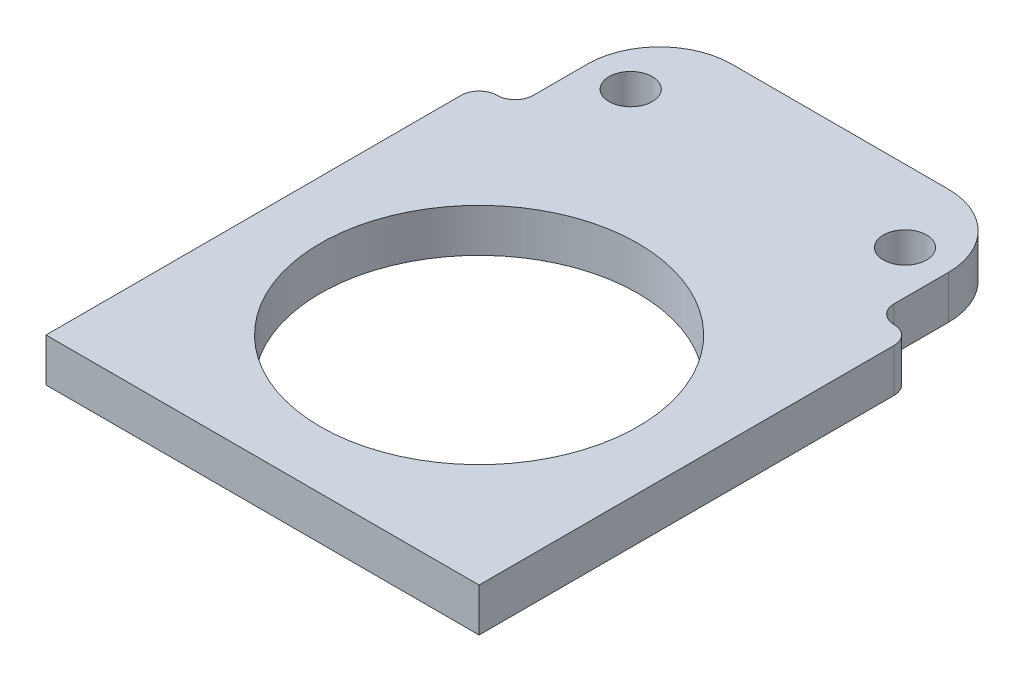
ISO-10303-21;
HEADER;
FILE_DESCRIPTION(('STEP AP214'),'2;1');
FILE_NAME('part.step','',(''),(''),'','','');
FILE_SCHEMA(('AUTOMOTIVE_DESIGN { 1 0 10303 214 1 1 1 1 }'));
ENDSEC;
DATA;
#1=APPLICATION_CONTEXT('core data for automotive mechanical design processes');
#2=APPLICATION_PROTOCOL_DEFINITION('international standard','automotive_design',2000,#1);
#3=PRODUCT_CONTEXT('',#1,'mechanical');
#4=PRODUCT('Part','Part','',(#3));
#5=PRODUCT_RELATED_PRODUCT_CATEGORY('part','',(#4));
#6=PRODUCT_DEFINITION_FORMATION('','',#4);
#7=PRODUCT_DEFINITION_CONTEXT('part definition',#1,'design');
#8=PRODUCT_DEFINITION('design','',#6,#7);
#9=PRODUCT_DEFINITION_SHAPE('','',#8);
#10=(LENGTH_UNIT() NAMED_UNIT(*) SI_UNIT(.MILLI.,.METRE.));
#11=(NAMED_UNIT(*) PLANE_ANGLE_UNIT() SI_UNIT($,.RADIAN.));
#12=(NAMED_UNIT(*) SI_UNIT($,.STERADIAN.) SOLID_ANGLE_UNIT());
#13=UNCERTAINTY_MEASURE_WITH_UNIT(LENGTH_MEASURE(1.E-05),#10,'distance_accuracy_value','');
#14=(GEOMETRIC_REPRESENTATION_CONTEXT(3) GLOBAL_UNCERTAINTY_ASSIGNED_CONTEXT((#13)) GLOBAL_UNIT_ASSIGNED_CONTEXT((#10,
#11,#12)) REPRESENTATION_CONTEXT('',''));
#15=CARTESIAN_POINT('',(0.,0.,0.));
#16=DIRECTION('',(0.,0.,1.));
#17=DIRECTION('',(1.,0.,0.));
#18=AXIS2_PLACEMENT_3D('',#15,#16,#17);
#19=CARTESIAN_POINT('',(12.5,3.,0.));
#20=DIRECTION('',(-1.,0.,0.));
#21=DIRECTION('',(0.,0.,1.));
#22=AXIS2_PLACEMENT_3D('',#19,#20,#21);
#23=PLANE('',#22);
#24=DIRECTION('',(0.,0.,-1.));
#25=VECTOR('',#24,1.);
#26=CARTESIAN_POINT('',(12.5,0.,0.));
#27=LINE('',#26,#25);
#28=CARTESIAN_POINT('',(12.5,0.,3.75));
#29=VERTEX_POINT('',#28);
#30=CARTESIAN_POINT('',(12.5,0.,0.));
#31=VERTEX_POINT('',#30);
#32=EDGE_CURVE('E214',#29,#31,#27,.T.);
#33=ORIENTED_EDGE('',*,*,#32,.T.);
#34=DIRECTION('',(0.,-1.,0.));
#35=VECTOR('',#34,1.);
#36=CARTESIAN_POINT('',(12.5,3.,0.));
#37=LINE('',#36,#35);
#38=CARTESIAN_POINT('',(12.5,3.,0.));
#39=VERTEX_POINT('',#38);
#40=EDGE_CURVE('E71',#31,#39,#37,.F.);
#41=ORIENTED_EDGE('',*,*,#40,.T.);
#42=DIRECTION('',(0.,0.,-1.));
#43=VECTOR('',#42,1.);
#44=CARTESIAN_POINT('',(12.5,3.,0.));
#45=LINE('',#44,#43);
#46=CARTESIAN_POINT('',(12.5,3.,3.75));
#47=VERTEX_POINT('',#46);
#48=EDGE_CURVE('E195',#47,#39,#45,.T.);
#49=ORIENTED_EDGE('',*,*,#48,.F.);
#50=DIRECTION('',(0.,-1.,0.));
#51=VECTOR('',#50,1.);
#52=CARTESIAN_POINT('',(12.5,0.,3.75));
#53=LINE('',#52,#51);
#54=EDGE_CURVE('E244',#47,#29,#53,.T.);
#55=ORIENTED_EDGE('',*,*,#54,.T.);
#56=EDGE_LOOP('',(#33,#41,#49,#55));
#57=FACE_BOUND('',#56,.T.);
#58=ADVANCED_FACE('F47',(#57),#23,.F.);
#59=CARTESIAN_POINT('',(0.,3.,-5.));
#60=DIRECTION('',(0.,0.,-1.));
#61=DIRECTION('',(-1.,0.,0.));
#62=AXIS2_PLACEMENT_3D('',#59,#60,#61);
#63=PLANE('',#62);
#64=DIRECTION('',(1.,0.,0.));
#65=VECTOR('',#64,1.);
#66=CARTESIAN_POINT('',(0.,3.,-5.));
#67=LINE('',#66,#65);
#68=CARTESIAN_POINT('',(-7.50000000000001,3.,-5.));
#69=VERTEX_POINT('',#68);
#70=CARTESIAN_POINT('',(7.5,3.,-5.));
#71=VERTEX_POINT('',#70);
#72=EDGE_CURVE('E199',#69,#71,#67,.T.);
#73=ORIENTED_EDGE('',*,*,#72,.T.);
#74=DIRECTION('',(0.,-1.,0.));
#75=VECTOR('',#74,1.);
#76=CARTESIAN_POINT('',(7.5,0.,-5.));
#77=LINE('',#76,#75);
#78=CARTESIAN_POINT('',(7.5,0.,-5.));
#79=VERTEX_POINT('',#78);
#80=EDGE_CURVE('E272',#71,#79,#77,.T.);
#81=ORIENTED_EDGE('',*,*,#80,.T.);
#82=DIRECTION('',(1.,0.,0.));
#83=VECTOR('',#82,1.);
#84=CARTESIAN_POINT('',(0.,0.,-5.));
#85=LINE('',#84,#83);
#86=CARTESIAN_POINT('',(-7.50000000000001,0.,-5.));
#87=VERTEX_POINT('',#86);
#88=EDGE_CURVE('E217',#87,#79,#85,.T.);
#89=ORIENTED_EDGE('',*,*,#88,.F.);
#90=DIRECTION('',(0.,-1.,0.));
#91=VECTOR('',#90,1.);
#92=CARTESIAN_POINT('',(-7.50000000000001,3.,-5.));
#93=LINE('',#92,#91);
#94=EDGE_CURVE('E262',#87,#69,#93,.F.);
#95=ORIENTED_EDGE('',*,*,#94,.T.);
#96=EDGE_LOOP('',(#73,#81,#89,#95));
#97=FACE_BOUND('',#96,.T.);
#98=ADVANCED_FACE('F292',(#97),#63,.T.);
#99=CARTESIAN_POINT('',(-12.5,3.,0.));
#100=DIRECTION('',(-1.,0.,0.));
#101=DIRECTION('',(0.,0.,1.));
#102=AXIS2_PLACEMENT_3D('',#99,#100,#101);
#103=PLANE('',#102);
#104=DIRECTION('',(0.,0.,-1.));
#105=VECTOR('',#104,1.);
#106=CARTESIAN_POINT('',(-12.5,3.,0.));
#107=LINE('',#106,#105);
#108=CARTESIAN_POINT('',(-12.5,3.,3.75));
#109=VERTEX_POINT('',#108);
#110=CARTESIAN_POINT('',(-12.5,3.,0.));
#111=VERTEX_POINT('',#110);
#112=EDGE_CURVE('E203',#109,#111,#107,.T.);
#113=ORIENTED_EDGE('',*,*,#112,.T.);
#114=DIRECTION('',(0.,-1.,0.));
#115=VECTOR('',#114,1.);
#116=CARTESIAN_POINT('',(-12.5,3.,0.));
#117=LINE('',#116,#115);
#118=CARTESIAN_POINT('',(-12.5,0.,0.));
#119=VERTEX_POINT('',#118);
#120=EDGE_CURVE('E11',#111,#119,#117,.T.);
#121=ORIENTED_EDGE('',*,*,#120,.T.);
#122=DIRECTION('',(0.,0.,-1.));
#123=VECTOR('',#122,1.);
#124=CARTESIAN_POINT('',(-12.5,0.,0.));
#125=LINE('',#124,#123);
#126=CARTESIAN_POINT('',(-12.5,0.,3.75));
#127=VERTEX_POINT('',#126);
#128=EDGE_CURVE('E220',#127,#119,#125,.T.);
#129=ORIENTED_EDGE('',*,*,#128,.F.);
#130=DIRECTION('',(0.,-1.,0.));
#131=VECTOR('',#130,1.);
#132=CARTESIAN_POINT('',(-12.5,3.,3.75));
#133=LINE('',#132,#131);
#134=EDGE_CURVE('E247',#127,#109,#133,.F.);
#135=ORIENTED_EDGE('',*,*,#134,.T.);
#136=EDGE_LOOP('',(#113,#121,#129,#135));
#137=FACE_BOUND('',#136,.T.);
#138=ADVANCED_FACE('F322',(#137),#103,.T.);
#139=CARTESIAN_POINT('',(-9.5,3.,0.));
#140=DIRECTION('',(0.,-1.,0.));
#141=DIRECTION('',(0.,0.,-1.));
#142=AXIS2_PLACEMENT_3D('',#139,#140,#141);
#143=CYLINDRICAL_SURFACE('',#142,1.5);
#144=CARTESIAN_POINT('',(-9.5,3.,0.));
#145=DIRECTION('',(0.,1.,0.));
#146=DIRECTION('',(0.,0.,1.));
#147=AXIS2_PLACEMENT_3D('',#144,#145,#146);
#148=CIRCLE('',#147,1.5);
#149=CARTESIAN_POINT('',(-9.5,3.,1.5));
#150=VERTEX_POINT('',#149);
#151=EDGE_CURVE('E191',#150,#150,#148,.T.);
#152=ORIENTED_EDGE('',*,*,#151,.T.);
#153=EDGE_LOOP('',(#152));
#154=FACE_BOUND('',#153,.T.);
#155=CARTESIAN_POINT('',(-9.5,0.,0.));
#156=DIRECTION('',(0.,1.,0.));
#157=DIRECTION('',(0.,0.,1.));
#158=AXIS2_PLACEMENT_3D('',#155,#156,#157);
#159=CIRCLE('',#158,1.5);
#160=CARTESIAN_POINT('',(-9.5,0.,1.5));
#161=VERTEX_POINT('',#160);
#162=EDGE_CURVE('E189',#161,#161,#159,.T.);
#163=ORIENTED_EDGE('',*,*,#162,.F.);
#164=EDGE_LOOP('',(#163));
#165=FACE_BOUND('',#164,.T.);
#166=ADVANCED_FACE('F338',(#154,#165),#143,.F.);
#167=CARTESIAN_POINT('',(9.49999999999997,3.,0.));
#168=DIRECTION('',(0.,-1.,0.));
#169=DIRECTION('',(0.,0.,-1.));
#170=AXIS2_PLACEMENT_3D('',#167,#168,#169);
#171=CYLINDRICAL_SURFACE('',#170,1.5);
#172=CARTESIAN_POINT('',(9.49999999999997,3.,0.));
#173=DIRECTION('',(0.,1.,0.));
#174=DIRECTION('',(0.,0.,1.));
#175=AXIS2_PLACEMENT_3D('',#172,#173,#174);
#176=CIRCLE('',#175,1.5);
#177=CARTESIAN_POINT('',(9.49999999999997,3.,1.5));
#178=VERTEX_POINT('',#177);
#179=EDGE_CURVE('E206',#178,#178,#176,.F.);
#180=ORIENTED_EDGE('',*,*,#179,.F.);
#181=EDGE_LOOP('',(#180));
#182=FACE_BOUND('',#181,.T.);
#183=CARTESIAN_POINT('',(9.49999999999997,0.,0.));
#184=DIRECTION('',(0.,1.,0.));
#185=DIRECTION('',(0.,0.,1.));
#186=AXIS2_PLACEMENT_3D('',#183,#184,#185);
#187=CIRCLE('',#186,1.5);
#188=CARTESIAN_POINT('',(9.49999999999997,0.,1.5));
#189=VERTEX_POINT('',#188);
#190=EDGE_CURVE('E196',#189,#189,#187,.F.);
#191=ORIENTED_EDGE('',*,*,#190,.T.);
#192=EDGE_LOOP('',(#191));
#193=FACE_BOUND('',#192,.T.);
#194=ADVANCED_FACE('F341',(#182,#193),#171,.F.);
#195=CARTESIAN_POINT('',(0.,3.,0.));
#196=DIRECTION('',(0.,1.,0.));
#197=DIRECTION('',(0.,0.,1.));
#198=AXIS2_PLACEMENT_3D('',#195,#196,#197);
#199=PLANE('',#198);
#200=ORIENTED_EDGE('',*,*,#151,.F.);
#201=EDGE_LOOP('',(#200));
#202=FACE_BOUND('',#201,.T.);
#203=ORIENTED_EDGE('',*,*,#48,.T.);
#204=CARTESIAN_POINT('',(7.5,3.,0.));
#205=DIRECTION('',(0.,1.,0.));
#206=DIRECTION('',(0.,0.,1.));
#207=AXIS2_PLACEMENT_3D('',#204,#205,#206);
#208=CIRCLE('',#207,5.);
#209=EDGE_CURVE('E56',#39,#71,#208,.T.);
#210=ORIENTED_EDGE('',*,*,#209,.T.);
#211=ORIENTED_EDGE('',*,*,#72,.F.);
#212=CARTESIAN_POINT('',(-7.50000000000001,3.,0.));
#213=DIRECTION('',(0.,1.,0.));
#214=DIRECTION('',(0.,0.,1.));
#215=AXIS2_PLACEMENT_3D('',#212,#213,#214);
#216=CIRCLE('',#215,5.);
#217=EDGE_CURVE('E63',#69,#111,#216,.T.);
#218=ORIENTED_EDGE('',*,*,#217,.T.);
#219=ORIENTED_EDGE('',*,*,#112,.F.);
#220=CARTESIAN_POINT('',(-13.75,3.,3.75));
#221=DIRECTION('',(0.,1.,0.));
#222=DIRECTION('',(0.,0.,1.));
#223=AXIS2_PLACEMENT_3D('',#220,#221,#222);
#224=CIRCLE('',#223,1.25);
#225=CARTESIAN_POINT('',(-13.75,3.,5.));
#226=VERTEX_POINT('',#225);
#227=EDGE_CURVE('E259',#109,#226,#224,.F.);
#228=ORIENTED_EDGE('',*,*,#227,.T.);
#229=CARTESIAN_POINT('',(-13.75,3.,6.25));
#230=DIRECTION('',(0.,1.,0.));
#231=DIRECTION('',(0.,0.,1.));
#232=AXIS2_PLACEMENT_3D('',#229,#230,#231);
#233=CIRCLE('',#232,1.25);
#234=CARTESIAN_POINT('',(-15.,3.,6.25));
#235=VERTEX_POINT('',#234);
#236=EDGE_CURVE('E229',#226,#235,#233,.T.);
#237=ORIENTED_EDGE('',*,*,#236,.T.);
#238=DIRECTION('',(0.,0.,-1.));
#239=VECTOR('',#238,1.);
#240=CARTESIAN_POINT('',(-15.,3.,0.));
#241=LINE('',#240,#239);
#242=CARTESIAN_POINT('',(-15.,3.,35.));
#243=VERTEX_POINT('',#242);
#244=EDGE_CURVE('E182',#243,#235,#241,.T.);
#245=ORIENTED_EDGE('',*,*,#244,.F.);
#246=DIRECTION('',(1.,0.,0.));
#247=VECTOR('',#246,1.);
#248=CARTESIAN_POINT('',(0.,3.,35.));
#249=LINE('',#248,#247);
#250=CARTESIAN_POINT('',(15.,3.,35.));
#251=VERTEX_POINT('',#250);
#252=EDGE_CURVE('E147',#243,#251,#249,.T.);
#253=ORIENTED_EDGE('',*,*,#252,.T.);
#254=DIRECTION('',(0.,0.,-1.));
#255=VECTOR('',#254,1.);
#256=CARTESIAN_POINT('',(15.,3.,0.));
#257=LINE('',#256,#255);
#258=CARTESIAN_POINT('',(15.,3.,6.25));
#259=VERTEX_POINT('',#258);
#260=EDGE_CURVE('E177',#251,#259,#257,.T.);
#261=ORIENTED_EDGE('',*,*,#260,.T.);
#262=CARTESIAN_POINT('',(13.75,3.,6.25));
#263=DIRECTION('',(0.,1.,0.));
#264=DIRECTION('',(0.,0.,1.));
#265=AXIS2_PLACEMENT_3D('',#262,#263,#264);
#266=CIRCLE('',#265,1.25);
#267=CARTESIAN_POINT('',(13.75,3.,5.));
#268=VERTEX_POINT('',#267);
#269=EDGE_CURVE('E210',#259,#268,#266,.T.);
#270=ORIENTED_EDGE('',*,*,#269,.T.);
#271=CARTESIAN_POINT('',(13.75,3.,3.75));
#272=DIRECTION('',(0.,1.,0.));
#273=DIRECTION('',(0.,0.,1.));
#274=AXIS2_PLACEMENT_3D('',#271,#272,#273);
#275=CIRCLE('',#274,1.25);
#276=EDGE_CURVE('E253',#268,#47,#275,.F.);
#277=ORIENTED_EDGE('',*,*,#276,.T.);
#278=EDGE_LOOP('',(#203,#210,#211,#218,#219,#228,#237,#245,#253,#261,#270,#277));
#279=FACE_BOUND('',#278,.T.);
#280=ORIENTED_EDGE('',*,*,#179,.T.);
#281=EDGE_LOOP('',(#280));
#282=FACE_BOUND('',#281,.T.);
#283=CARTESIAN_POINT('',(0.,3.,20.));
#284=DIRECTION('',(0.,1.,0.));
#285=DIRECTION('',(0.,0.,1.));
#286=AXIS2_PLACEMENT_3D('',#283,#284,#285);
#287=CIRCLE('',#286,11.);
#288=CARTESIAN_POINT('',(0.,3.,31.));
#289=VERTEX_POINT('',#288);
#290=EDGE_CURVE('E173',#289,#289,#287,.T.);
#291=ORIENTED_EDGE('',*,*,#290,.F.);
#292=EDGE_LOOP('',(#291));
#293=FACE_BOUND('',#292,.T.);
#294=ADVANCED_FACE('F287',(#202,#279,#282,#293),#199,.T.);
#295=CARTESIAN_POINT('',(0.,0.,0.));
#296=DIRECTION('',(0.,1.,0.));
#297=DIRECTION('',(0.,0.,1.));
#298=AXIS2_PLACEMENT_3D('',#295,#296,#297);
#299=PLANE('',#298);
#300=ORIENTED_EDGE('',*,*,#162,.T.);
#301=EDGE_LOOP('',(#300));
#302=FACE_BOUND('',#301,.T.);
#303=ORIENTED_EDGE('',*,*,#88,.T.);
#304=CARTESIAN_POINT('',(7.5,0.,0.));
#305=DIRECTION('',(0.,1.,0.));
#306=DIRECTION('',(0.,0.,1.));
#307=AXIS2_PLACEMENT_3D('',#304,#305,#306);
#308=CIRCLE('',#307,5.);
#309=EDGE_CURVE('E279',#79,#31,#308,.F.);
#310=ORIENTED_EDGE('',*,*,#309,.T.);
#311=ORIENTED_EDGE('',*,*,#32,.F.);
#312=CARTESIAN_POINT('',(13.75,0.,3.75));
#313=DIRECTION('',(0.,1.,0.));
#314=DIRECTION('',(0.,0.,1.));
#315=AXIS2_PLACEMENT_3D('',#312,#313,#314);
#316=CIRCLE('',#315,1.25);
#317=CARTESIAN_POINT('',(13.75,0.,5.));
#318=VERTEX_POINT('',#317);
#319=EDGE_CURVE('E250',#29,#318,#316,.T.);
#320=ORIENTED_EDGE('',*,*,#319,.T.);
#321=CARTESIAN_POINT('',(13.75,0.,6.25));
#322=DIRECTION('',(0.,1.,0.));
#323=DIRECTION('',(0.,0.,1.));
#324=AXIS2_PLACEMENT_3D('',#321,#322,#323);
#325=CIRCLE('',#324,1.25);
#326=CARTESIAN_POINT('',(15.,0.,6.25));
#327=VERTEX_POINT('',#326);
#328=EDGE_CURVE('E234',#318,#327,#325,.F.);
#329=ORIENTED_EDGE('',*,*,#328,.T.);
#330=DIRECTION('',(0.,0.,-1.));
#331=VECTOR('',#330,1.);
#332=CARTESIAN_POINT('',(15.,0.,0.));
#333=LINE('',#332,#331);
#334=CARTESIAN_POINT('',(15.,0.,35.));
#335=VERTEX_POINT('',#334);
#336=EDGE_CURVE('E162',#335,#327,#333,.T.);
#337=ORIENTED_EDGE('',*,*,#336,.F.);
#338=DIRECTION('',(1.,0.,0.));
#339=VECTOR('',#338,1.);
#340=CARTESIAN_POINT('',(0.,0.,35.));
#341=LINE('',#340,#339);
#342=CARTESIAN_POINT('',(-15.,0.,35.));
#343=VERTEX_POINT('',#342);
#344=EDGE_CURVE('E145',#343,#335,#341,.T.);
#345=ORIENTED_EDGE('',*,*,#344,.F.);
#346=DIRECTION('',(0.,0.,-1.));
#347=VECTOR('',#346,1.);
#348=CARTESIAN_POINT('',(-15.,0.,0.));
#349=LINE('',#348,#347);
#350=CARTESIAN_POINT('',(-15.,0.,6.25));
#351=VERTEX_POINT('',#350);
#352=EDGE_CURVE('E156',#343,#351,#349,.T.);
#353=ORIENTED_EDGE('',*,*,#352,.T.);
#354=CARTESIAN_POINT('',(-13.75,0.,6.25));
#355=DIRECTION('',(0.,1.,0.));
#356=DIRECTION('',(0.,0.,1.));
#357=AXIS2_PLACEMENT_3D('',#354,#355,#356);
#358=CIRCLE('',#357,1.25);
#359=CARTESIAN_POINT('',(-13.75,0.,5.));
#360=VERTEX_POINT('',#359);
#361=EDGE_CURVE('E237',#351,#360,#358,.F.);
#362=ORIENTED_EDGE('',*,*,#361,.T.);
#363=CARTESIAN_POINT('',(-13.75,0.,3.75));
#364=DIRECTION('',(0.,1.,0.));
#365=DIRECTION('',(0.,0.,1.));
#366=AXIS2_PLACEMENT_3D('',#363,#364,#365);
#367=CIRCLE('',#366,1.25);
#368=EDGE_CURVE('E256',#360,#127,#367,.T.);
#369=ORIENTED_EDGE('',*,*,#368,.T.);
#370=ORIENTED_EDGE('',*,*,#128,.T.);
#371=CARTESIAN_POINT('',(-7.50000000000001,0.,0.));
#372=DIRECTION('',(0.,1.,0.));
#373=DIRECTION('',(0.,0.,1.));
#374=AXIS2_PLACEMENT_3D('',#371,#372,#373);
#375=CIRCLE('',#374,5.);
#376=EDGE_CURVE('E276',#119,#87,#375,.F.);
#377=ORIENTED_EDGE('',*,*,#376,.T.);
#378=EDGE_LOOP('',(#303,#310,#311,#320,#329,#337,#345,#353,#362,#369,#370,#377));
#379=FACE_BOUND('',#378,.T.);
#380=ORIENTED_EDGE('',*,*,#190,.F.);
#381=EDGE_LOOP('',(#380));
#382=FACE_BOUND('',#381,.T.);
#383=CARTESIAN_POINT('',(0.,0.,20.));
#384=DIRECTION('',(0.,1.,0.));
#385=DIRECTION('',(0.,0.,1.));
#386=AXIS2_PLACEMENT_3D('',#383,#384,#385);
#387=CIRCLE('',#386,11.);
#388=CARTESIAN_POINT('',(0.,0.,31.));
#389=VERTEX_POINT('',#388);
#390=EDGE_CURVE('E187',#389,#389,#387,.T.);
#391=ORIENTED_EDGE('',*,*,#390,.T.);
#392=EDGE_LOOP('',(#391));
#393=FACE_BOUND('',#392,.T.);
#394=ADVANCED_FACE('F166',(#302,#379,#382,#393),#299,.F.);
#395=CARTESIAN_POINT('',(15.,0.,0.));
#396=DIRECTION('',(1.,0.,0.));
#397=DIRECTION('',(0.,0.,-1.));
#398=AXIS2_PLACEMENT_3D('',#395,#396,#397);
#399=PLANE('',#398);
#400=ORIENTED_EDGE('',*,*,#336,.T.);
#401=DIRECTION('',(0.,1.,0.));
#402=VECTOR('',#401,1.);
#403=CARTESIAN_POINT('',(15.,3.,6.25));
#404=LINE('',#403,#402);
#405=EDGE_CURVE('E240',#327,#259,#404,.T.);
#406=ORIENTED_EDGE('',*,*,#405,.T.);
#407=ORIENTED_EDGE('',*,*,#260,.F.);
#408=DIRECTION('',(0.,1.,0.));
#409=VECTOR('',#408,1.);
#410=CARTESIAN_POINT('',(15.,0.,35.));
#411=LINE('',#410,#409);
#412=EDGE_CURVE('E152',#335,#251,#411,.T.);
#413=ORIENTED_EDGE('',*,*,#412,.F.);
#414=EDGE_LOOP('',(#400,#406,#407,#413));
#415=FACE_BOUND('',#414,.T.);
#416=ADVANCED_FACE('F307',(#415),#399,.T.);
#417=CARTESIAN_POINT('',(0.,0.,35.));
#418=DIRECTION('',(0.,0.,1.));
#419=DIRECTION('',(1.,0.,0.));
#420=AXIS2_PLACEMENT_3D('',#417,#418,#419);
#421=PLANE('',#420);
#422=ORIENTED_EDGE('',*,*,#252,.F.);
#423=DIRECTION('',(0.,1.,0.));
#424=VECTOR('',#423,1.);
#425=CARTESIAN_POINT('',(-15.,0.,35.));
#426=LINE('',#425,#424);
#427=EDGE_CURVE('E141',#343,#243,#426,.T.);
#428=ORIENTED_EDGE('',*,*,#427,.F.);
#429=ORIENTED_EDGE('',*,*,#344,.T.);
#430=ORIENTED_EDGE('',*,*,#412,.T.);
#431=EDGE_LOOP('',(#422,#428,#429,#430));
#432=FACE_BOUND('',#431,.T.);
#433=ADVANCED_FACE('F143',(#432),#421,.T.);
#434=CARTESIAN_POINT('',(-15.,0.,0.));
#435=DIRECTION('',(1.,0.,0.));
#436=DIRECTION('',(0.,0.,-1.));
#437=AXIS2_PLACEMENT_3D('',#434,#435,#436);
#438=PLANE('',#437);
#439=ORIENTED_EDGE('',*,*,#244,.T.);
#440=DIRECTION('',(0.,1.,0.));
#441=VECTOR('',#440,1.);
#442=CARTESIAN_POINT('',(-15.,0.,6.25));
#443=LINE('',#442,#441);
#444=EDGE_CURVE('E159',#235,#351,#443,.F.);
#445=ORIENTED_EDGE('',*,*,#444,.T.);
#446=ORIENTED_EDGE('',*,*,#352,.F.);
#447=ORIENTED_EDGE('',*,*,#427,.T.);
#448=EDGE_LOOP('',(#439,#445,#446,#447));
#449=FACE_BOUND('',#448,.T.);
#450=ADVANCED_FACE('F157',(#449),#438,.F.);
#451=CARTESIAN_POINT('',(0.,0.,20.));
#452=DIRECTION('',(0.,1.,0.));
#453=DIRECTION('',(0.,0.,1.));
#454=AXIS2_PLACEMENT_3D('',#451,#452,#453);
#455=CYLINDRICAL_SURFACE('',#454,11.);
#456=ORIENTED_EDGE('',*,*,#390,.F.);
#457=EDGE_LOOP('',(#456));
#458=FACE_BOUND('',#457,.T.);
#459=ORIENTED_EDGE('',*,*,#290,.T.);
#460=EDGE_LOOP('',(#459));
#461=FACE_BOUND('',#460,.T.);
#462=ADVANCED_FACE('F347',(#458,#461),#455,.F.);
#463=CARTESIAN_POINT('',(-13.75,0.,3.75));
#464=DIRECTION('',(0.,-1.,0.));
#465=DIRECTION('',(0.,0.,-1.));
#466=AXIS2_PLACEMENT_3D('',#463,#464,#465);
#467=CYLINDRICAL_SURFACE('',#466,1.25);
#468=ORIENTED_EDGE('',*,*,#134,.F.);
#469=ORIENTED_EDGE('',*,*,#368,.F.);
#470=DIRECTION('',(0.,-1.,0.));
#471=VECTOR('',#470,1.);
#472=CARTESIAN_POINT('',(-13.75,0.,5.));
#473=LINE('',#472,#471);
#474=EDGE_CURVE('E178',#226,#360,#473,.T.);
#475=ORIENTED_EDGE('',*,*,#474,.F.);
#476=ORIENTED_EDGE('',*,*,#227,.F.);
#477=EDGE_LOOP('',(#468,#469,#475,#476));
#478=FACE_BOUND('',#477,.T.);
#479=ADVANCED_FACE('F319',(#478),#467,.F.);
#480=CARTESIAN_POINT('',(-13.75,0.,6.25));
#481=DIRECTION('',(0.,1.,0.));
#482=DIRECTION('',(0.,0.,1.));
#483=AXIS2_PLACEMENT_3D('',#480,#481,#482);
#484=CYLINDRICAL_SURFACE('',#483,1.25);
#485=ORIENTED_EDGE('',*,*,#361,.F.);
#486=ORIENTED_EDGE('',*,*,#444,.F.);
#487=ORIENTED_EDGE('',*,*,#236,.F.);
#488=ORIENTED_EDGE('',*,*,#474,.T.);
#489=EDGE_LOOP('',(#485,#486,#487,#488));
#490=FACE_BOUND('',#489,.T.);
#491=ADVANCED_FACE('F313',(#490),#484,.T.);
#492=CARTESIAN_POINT('',(13.75,3.,3.75));
#493=DIRECTION('',(0.,1.,0.));
#494=DIRECTION('',(0.,0.,1.));
#495=AXIS2_PLACEMENT_3D('',#492,#493,#494);
#496=CYLINDRICAL_SURFACE('',#495,1.25);
#497=DIRECTION('',(0.,-1.,0.));
#498=VECTOR('',#497,1.);
#499=CARTESIAN_POINT('',(13.75,3.,5.));
#500=LINE('',#499,#498);
#501=EDGE_CURVE('E266',#318,#268,#500,.F.);
#502=ORIENTED_EDGE('',*,*,#501,.F.);
#503=ORIENTED_EDGE('',*,*,#319,.F.);
#504=ORIENTED_EDGE('',*,*,#54,.F.);
#505=ORIENTED_EDGE('',*,*,#276,.F.);
#506=EDGE_LOOP('',(#502,#503,#504,#505));
#507=FACE_BOUND('',#506,.T.);
#508=ADVANCED_FACE('F302',(#507),#496,.F.);
#509=CARTESIAN_POINT('',(13.75,0.,6.25));
#510=DIRECTION('',(0.,-1.,0.));
#511=DIRECTION('',(0.,0.,-1.));
#512=AXIS2_PLACEMENT_3D('',#509,#510,#511);
#513=CYLINDRICAL_SURFACE('',#512,1.25);
#514=ORIENTED_EDGE('',*,*,#328,.F.);
#515=ORIENTED_EDGE('',*,*,#501,.T.);
#516=ORIENTED_EDGE('',*,*,#269,.F.);
#517=ORIENTED_EDGE('',*,*,#405,.F.);
#518=EDGE_LOOP('',(#514,#515,#516,#517));
#519=FACE_BOUND('',#518,.T.);
#520=ADVANCED_FACE('F310',(#519),#513,.T.);
#521=CARTESIAN_POINT('',(7.5,3.,0.));
#522=DIRECTION('',(0.,1.,0.));
#523=DIRECTION('',(0.,0.,1.));
#524=AXIS2_PLACEMENT_3D('',#521,#522,#523);
#525=CYLINDRICAL_SURFACE('',#524,5.);
#526=ORIENTED_EDGE('',*,*,#209,.F.);
#527=ORIENTED_EDGE('',*,*,#40,.F.);
#528=ORIENTED_EDGE('',*,*,#309,.F.);
#529=ORIENTED_EDGE('',*,*,#80,.F.);
#530=EDGE_LOOP('',(#526,#527,#528,#529));
#531=FACE_BOUND('',#530,.T.);
#532=ADVANCED_FACE('F295',(#531),#525,.T.);
#533=CARTESIAN_POINT('',(-7.50000000000001,3.,0.));
#534=DIRECTION('',(0.,-1.,0.));
#535=DIRECTION('',(0.,0.,-1.));
#536=AXIS2_PLACEMENT_3D('',#533,#534,#535);
#537=CYLINDRICAL_SURFACE('',#536,5.);
#538=ORIENTED_EDGE('',*,*,#217,.F.);
#539=ORIENTED_EDGE('',*,*,#94,.F.);
#540=ORIENTED_EDGE('',*,*,#376,.F.);
#541=ORIENTED_EDGE('',*,*,#120,.F.);
#542=EDGE_LOOP('',(#538,#539,#540,#541));
#543=FACE_BOUND('',#542,.T.);
#544=ADVANCED_FACE('F49',(#543),#537,.T.);
#545=CLOSED_SHELL('',(#58,#98,#138,#166,#194,#294,#394,#416,#433,#450,#462,#479,#491,#508,#520,
#532,#544));
#546=MANIFOLD_SOLID_BREP('B2',#545);
#547=ADVANCED_BREP_SHAPE_REPRESENTATION('',(#18,#546),#14);
#548=SHAPE_DEFINITION_REPRESENTATION(#9,#547);
ENDSEC;
END-ISO-10303-21;
